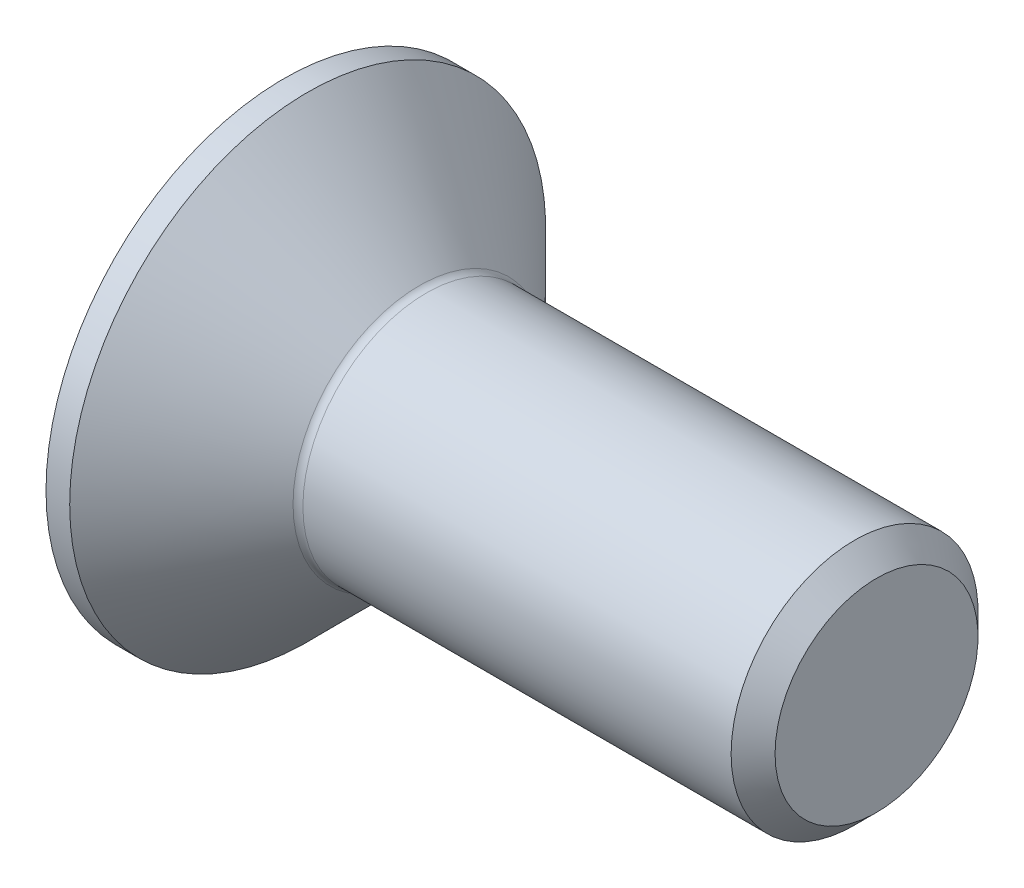
ISO-10303-21;
HEADER;
FILE_DESCRIPTION(('STEP AP214'),'2;1');
FILE_NAME('part.step','',(''),(''),'','','');
FILE_SCHEMA(('AUTOMOTIVE_DESIGN { 1 0 10303 214 1 1 1 1 }'));
ENDSEC;
DATA;
#1=APPLICATION_CONTEXT('core data for automotive mechanical design processes');
#2=APPLICATION_PROTOCOL_DEFINITION('international standard','automotive_design',2000,#1);
#3=PRODUCT_CONTEXT('',#1,'mechanical');
#4=PRODUCT('Part','Part','',(#3));
#5=PRODUCT_RELATED_PRODUCT_CATEGORY('part','',(#4));
#6=PRODUCT_DEFINITION_FORMATION('','',#4);
#7=PRODUCT_DEFINITION_CONTEXT('part definition',#1,'design');
#8=PRODUCT_DEFINITION('design','',#6,#7);
#9=PRODUCT_DEFINITION_SHAPE('','',#8);
#10=(LENGTH_UNIT() NAMED_UNIT(*) SI_UNIT(.MILLI.,.METRE.));
#11=(NAMED_UNIT(*) PLANE_ANGLE_UNIT() SI_UNIT($,.RADIAN.));
#12=(NAMED_UNIT(*) SI_UNIT($,.STERADIAN.) SOLID_ANGLE_UNIT());
#13=UNCERTAINTY_MEASURE_WITH_UNIT(LENGTH_MEASURE(1.E-05),#10,'distance_accuracy_value','');
#14=(GEOMETRIC_REPRESENTATION_CONTEXT(3) GLOBAL_UNCERTAINTY_ASSIGNED_CONTEXT((#13)) GLOBAL_UNIT_ASSIGNED_CONTEXT((#10,
#11,#12)) REPRESENTATION_CONTEXT('',''));
#15=CARTESIAN_POINT('',(0.,0.,0.));
#16=DIRECTION('',(0.,0.,1.));
#17=DIRECTION('',(1.,0.,0.));
#18=AXIS2_PLACEMENT_3D('',#15,#16,#17);
#19=CARTESIAN_POINT('',(0.,0.,0.));
#20=DIRECTION('',(-1.,0.,0.));
#21=DIRECTION('',(0.,0.,1.));
#22=AXIS2_PLACEMENT_3D('',#19,#20,#21);
#23=PLANE('',#22);
#24=CARTESIAN_POINT('',(0.,0.,0.));
#25=DIRECTION('',(-1.,0.,0.));
#26=DIRECTION('',(0.,0.,1.));
#27=AXIS2_PLACEMENT_3D('',#24,#25,#26);
#28=CIRCLE('',#27,4.82);
#29=CARTESIAN_POINT('',(0.,0.,4.82));
#30=VERTEX_POINT('',#29);
#31=EDGE_CURVE('E158',#30,#30,#28,.T.);
#32=ORIENTED_EDGE('',*,*,#31,.T.);
#33=EDGE_LOOP('',(#32));
#34=FACE_BOUND('',#33,.T.);
#35=DIRECTION('',(0.,-0.5,-0.866025403784439));
#36=VECTOR('',#35,1.);
#37=CARTESIAN_POINT('',(0.,-0.871798906476335,1.51));
#38=LINE('',#37,#36);
#39=CARTESIAN_POINT('',(0.,-0.871798906476335,1.51));
#40=VERTEX_POINT('',#39);
#41=CARTESIAN_POINT('',(0.,-1.74359781295267,0.));
#42=VERTEX_POINT('',#41);
#43=EDGE_CURVE('E120',#40,#42,#38,.T.);
#44=ORIENTED_EDGE('',*,*,#43,.T.);
#45=DIRECTION('',(0.,0.5,-0.866025403784439));
#46=VECTOR('',#45,1.);
#47=CARTESIAN_POINT('',(0.,-1.74359781295267,0.));
#48=LINE('',#47,#46);
#49=CARTESIAN_POINT('',(0.,-0.871798906476335,-1.51));
#50=VERTEX_POINT('',#49);
#51=EDGE_CURVE('E50',#42,#50,#48,.T.);
#52=ORIENTED_EDGE('',*,*,#51,.T.);
#53=DIRECTION('',(0.,1.,0.));
#54=VECTOR('',#53,1.);
#55=CARTESIAN_POINT('',(0.,-0.871798906476335,-1.51));
#56=LINE('',#55,#54);
#57=CARTESIAN_POINT('',(0.,0.871798906476335,-1.51));
#58=VERTEX_POINT('',#57);
#59=EDGE_CURVE('E135',#50,#58,#56,.T.);
#60=ORIENTED_EDGE('',*,*,#59,.T.);
#61=DIRECTION('',(0.,0.5,0.866025403784439));
#62=VECTOR('',#61,1.);
#63=CARTESIAN_POINT('',(0.,0.871798906476335,-1.51));
#64=LINE('',#63,#62);
#65=CARTESIAN_POINT('',(0.,1.74359781295267,0.));
#66=VERTEX_POINT('',#65);
#67=EDGE_CURVE('E271',#58,#66,#64,.T.);
#68=ORIENTED_EDGE('',*,*,#67,.T.);
#69=DIRECTION('',(0.,-0.5,0.866025403784439));
#70=VECTOR('',#69,1.);
#71=CARTESIAN_POINT('',(0.,1.74359781295267,0.));
#72=LINE('',#71,#70);
#73=CARTESIAN_POINT('',(0.,0.871798906476335,1.51));
#74=VERTEX_POINT('',#73);
#75=EDGE_CURVE('E274',#66,#74,#72,.T.);
#76=ORIENTED_EDGE('',*,*,#75,.T.);
#77=DIRECTION('',(0.,-1.,0.));
#78=VECTOR('',#77,1.);
#79=CARTESIAN_POINT('',(0.,0.871798906476335,1.51));
#80=LINE('',#79,#78);
#81=EDGE_CURVE('E277',#74,#40,#80,.T.);
#82=ORIENTED_EDGE('',*,*,#81,.T.);
#83=EDGE_LOOP('',(#44,#52,#60,#68,#76,#82));
#84=FACE_BOUND('',#83,.T.);
#85=ADVANCED_FACE('F35',(#34,#84),#23,.T.);
#86=CARTESIAN_POINT('',(0.,0.,0.));
#87=DIRECTION('',(-1.,0.,0.));
#88=DIRECTION('',(0.,0.,1.));
#89=AXIS2_PLACEMENT_3D('',#86,#87,#88);
#90=CYLINDRICAL_SURFACE('',#89,4.82);
#91=CARTESIAN_POINT('',(0.480000000000009,0.,0.));
#92=DIRECTION('',(-1.,0.,0.));
#93=DIRECTION('',(0.,0.,1.));
#94=AXIS2_PLACEMENT_3D('',#91,#92,#93);
#95=CIRCLE('',#94,4.82);
#96=CARTESIAN_POINT('',(0.480000000000009,0.,4.82));
#97=VERTEX_POINT('',#96);
#98=EDGE_CURVE('E155',#97,#97,#95,.T.);
#99=ORIENTED_EDGE('',*,*,#98,.T.);
#100=EDGE_LOOP('',(#99));
#101=FACE_BOUND('',#100,.T.);
#102=ORIENTED_EDGE('',*,*,#31,.F.);
#103=EDGE_LOOP('',(#102));
#104=FACE_BOUND('',#103,.T.);
#105=ADVANCED_FACE('F179',(#101,#104),#90,.T.);
#106=CARTESIAN_POINT('',(0.480000000000009,0.,0.));
#107=DIRECTION('',(-1.,0.,0.));
#108=DIRECTION('',(0.,0.,1.));
#109=AXIS2_PLACEMENT_3D('',#106,#107,#108);
#110=CONICAL_SURFACE('',#109,4.82,0.78539816339745);
#111=CARTESIAN_POINT('',(2.74142135623732,0.,0.));
#112=DIRECTION('',(-1.,0.,0.));
#113=DIRECTION('',(0.,0.,1.));
#114=AXIS2_PLACEMENT_3D('',#111,#112,#113);
#115=CIRCLE('',#114,2.55857864376268);
#116=CARTESIAN_POINT('',(2.74142135623732,0.,2.55857864376268));
#117=VERTEX_POINT('',#116);
#118=EDGE_CURVE('E43',#117,#117,#115,.T.);
#119=ORIENTED_EDGE('',*,*,#118,.T.);
#120=EDGE_LOOP('',(#119));
#121=FACE_BOUND('',#120,.T.);
#122=ORIENTED_EDGE('',*,*,#98,.F.);
#123=EDGE_LOOP('',(#122));
#124=FACE_BOUND('',#123,.T.);
#125=ADVANCED_FACE('F163',(#121,#124),#110,.T.);
#126=CARTESIAN_POINT('',(0.,0.,0.));
#127=DIRECTION('',(-1.,0.,0.));
#128=DIRECTION('',(0.,0.,1.));
#129=AXIS2_PLACEMENT_3D('',#126,#127,#128);
#130=CYLINDRICAL_SURFACE('',#129,2.49999999999999);
#131=CARTESIAN_POINT('',(2.88284271247463,0.,0.));
#132=DIRECTION('',(-1.,0.,0.));
#133=DIRECTION('',(0.,0.,1.));
#134=AXIS2_PLACEMENT_3D('',#131,#132,#133);
#135=CIRCLE('',#134,2.49999999999999);
#136=CARTESIAN_POINT('',(2.88284271247463,0.,2.49999999999999));
#137=VERTEX_POINT('',#136);
#138=EDGE_CURVE('E11',#137,#137,#135,.F.);
#139=ORIENTED_EDGE('',*,*,#138,.T.);
#140=EDGE_LOOP('',(#139));
#141=FACE_BOUND('',#140,.T.);
#142=CARTESIAN_POINT('',(11.555,0.,0.));
#143=DIRECTION('',(-1.,0.,0.));
#144=DIRECTION('',(0.,0.,1.));
#145=AXIS2_PLACEMENT_3D('',#142,#143,#144);
#146=CIRCLE('',#145,2.49999999999999);
#147=CARTESIAN_POINT('',(11.555,0.,2.49999999999999));
#148=VERTEX_POINT('',#147);
#149=EDGE_CURVE('E152',#148,#148,#146,.T.);
#150=ORIENTED_EDGE('',*,*,#149,.T.);
#151=EDGE_LOOP('',(#150));
#152=FACE_BOUND('',#151,.T.);
#153=ADVANCED_FACE('F190',(#141,#152),#130,.T.);
#154=CARTESIAN_POINT('',(12.,0.,0.));
#155=DIRECTION('',(-1.,0.,0.));
#156=DIRECTION('',(0.,0.,1.));
#157=AXIS2_PLACEMENT_3D('',#154,#155,#156);
#158=CONICAL_SURFACE('',#157,2.055,0.785398163397428);
#159=ORIENTED_EDGE('',*,*,#149,.F.);
#160=EDGE_LOOP('',(#159));
#161=FACE_BOUND('',#160,.T.);
#162=CARTESIAN_POINT('',(12.,0.,0.));
#163=DIRECTION('',(-1.,0.,0.));
#164=DIRECTION('',(0.,0.,1.));
#165=AXIS2_PLACEMENT_3D('',#162,#163,#164);
#166=CIRCLE('',#165,2.055);
#167=CARTESIAN_POINT('',(12.,0.,2.055));
#168=VERTEX_POINT('',#167);
#169=EDGE_CURVE('E148',#168,#168,#166,.T.);
#170=ORIENTED_EDGE('',*,*,#169,.T.);
#171=EDGE_LOOP('',(#170));
#172=FACE_BOUND('',#171,.T.);
#173=ADVANCED_FACE('F174',(#161,#172),#158,.T.);
#174=CARTESIAN_POINT('',(12.,2.055,0.));
#175=DIRECTION('',(1.,0.,0.));
#176=DIRECTION('',(0.,0.,-1.));
#177=AXIS2_PLACEMENT_3D('',#174,#175,#176);
#178=PLANE('',#177);
#179=ORIENTED_EDGE('',*,*,#169,.F.);
#180=EDGE_LOOP('',(#179));
#181=FACE_BOUND('',#180,.T.);
#182=ADVANCED_FACE('F167',(#181),#178,.T.);
#183=CARTESIAN_POINT('',(2.88284271247463,0.,0.));
#184=DIRECTION('',(-1.,0.,0.));
#185=DIRECTION('',(0.,0.,1.));
#186=AXIS2_PLACEMENT_3D('',#183,#184,#185);
#187=TOROIDAL_SURFACE('',#186,2.69999999999999,0.2);
#188=ORIENTED_EDGE('',*,*,#138,.F.);
#189=EDGE_LOOP('',(#188));
#190=FACE_BOUND('',#189,.T.);
#191=ORIENTED_EDGE('',*,*,#118,.F.);
#192=EDGE_LOOP('',(#191));
#193=FACE_BOUND('',#192,.T.);
#194=ADVANCED_FACE('F37',(#190,#193),#187,.F.);
#195=CARTESIAN_POINT('',(2.3,-1.74359781295267,0.));
#196=DIRECTION('',(0.,0.866025403784438,0.5));
#197=DIRECTION('',(0.,-0.5,0.866025403784439));
#198=AXIS2_PLACEMENT_3D('',#195,#196,#197);
#199=PLANE('',#198);
#200=ORIENTED_EDGE('',*,*,#51,.F.);
#201=DIRECTION('',(-1.,0.,0.));
#202=VECTOR('',#201,1.);
#203=CARTESIAN_POINT('',(2.3,-1.74359781295267,0.));
#204=LINE('',#203,#202);
#205=CARTESIAN_POINT('',(2.3,-1.74359781295267,0.));
#206=VERTEX_POINT('',#205);
#207=EDGE_CURVE('E268',#206,#42,#204,.T.);
#208=ORIENTED_EDGE('',*,*,#207,.F.);
#209=DIRECTION('',(0.,0.5,-0.866025403784439));
#210=VECTOR('',#209,1.);
#211=CARTESIAN_POINT('',(2.3,-1.74359781295267,0.));
#212=LINE('',#211,#210);
#213=CARTESIAN_POINT('',(2.3,-1.3076983597145,-0.755000000000001));
#214=VERTEX_POINT('',#213);
#215=EDGE_CURVE('E117',#206,#214,#212,.T.);
#216=ORIENTED_EDGE('',*,*,#215,.T.);
#217=CARTESIAN_POINT('',(2.3,-0.871798906476335,-1.51));
#218=VERTEX_POINT('',#217);
#219=EDGE_CURVE('E111',#214,#218,#212,.T.);
#220=ORIENTED_EDGE('',*,*,#219,.T.);
#221=DIRECTION('',(-1.,0.,0.));
#222=VECTOR('',#221,1.);
#223=CARTESIAN_POINT('',(2.3,-0.871798906476335,-1.51));
#224=LINE('',#223,#222);
#225=EDGE_CURVE('E115',#218,#50,#224,.T.);
#226=ORIENTED_EDGE('',*,*,#225,.T.);
#227=EDGE_LOOP('',(#200,#208,#216,#220,#226));
#228=FACE_BOUND('',#227,.T.);
#229=ADVANCED_FACE('F113',(#228),#199,.T.);
#230=CARTESIAN_POINT('',(2.3,-0.871798906476335,-1.51));
#231=DIRECTION('',(0.,0.,1.));
#232=DIRECTION('',(1.,0.,0.));
#233=AXIS2_PLACEMENT_3D('',#230,#231,#232);
#234=PLANE('',#233);
#235=ORIENTED_EDGE('',*,*,#59,.F.);
#236=ORIENTED_EDGE('',*,*,#225,.F.);
#237=DIRECTION('',(0.,1.,0.));
#238=VECTOR('',#237,1.);
#239=CARTESIAN_POINT('',(2.3,-0.871798906476335,-1.51));
#240=LINE('',#239,#238);
#241=CARTESIAN_POINT('',(2.3,0.,-1.51));
#242=VERTEX_POINT('',#241);
#243=EDGE_CURVE('E123',#218,#242,#240,.T.);
#244=ORIENTED_EDGE('',*,*,#243,.T.);
#245=CARTESIAN_POINT('',(2.3,0.871798906476335,-1.51));
#246=VERTEX_POINT('',#245);
#247=EDGE_CURVE('E130',#242,#246,#240,.T.);
#248=ORIENTED_EDGE('',*,*,#247,.T.);
#249=DIRECTION('',(-1.,0.,0.));
#250=VECTOR('',#249,1.);
#251=CARTESIAN_POINT('',(2.3,0.871798906476335,-1.51));
#252=LINE('',#251,#250);
#253=EDGE_CURVE('E137',#246,#58,#252,.T.);
#254=ORIENTED_EDGE('',*,*,#253,.T.);
#255=EDGE_LOOP('',(#235,#236,#244,#248,#254));
#256=FACE_BOUND('',#255,.T.);
#257=ADVANCED_FACE('F132',(#256),#234,.T.);
#258=CARTESIAN_POINT('',(2.3,0.871798906476335,-1.51));
#259=DIRECTION('',(0.,-0.866025403784439,0.5));
#260=DIRECTION('',(0.,-0.5,-0.866025403784438));
#261=AXIS2_PLACEMENT_3D('',#258,#259,#260);
#262=PLANE('',#261);
#263=ORIENTED_EDGE('',*,*,#67,.F.);
#264=ORIENTED_EDGE('',*,*,#253,.F.);
#265=DIRECTION('',(0.,0.5,0.866025403784439));
#266=VECTOR('',#265,1.);
#267=CARTESIAN_POINT('',(2.3,0.871798906476335,-1.51));
#268=LINE('',#267,#266);
#269=CARTESIAN_POINT('',(2.3,1.3076983597145,-0.755));
#270=VERTEX_POINT('',#269);
#271=EDGE_CURVE('E260',#246,#270,#268,.T.);
#272=ORIENTED_EDGE('',*,*,#271,.T.);
#273=CARTESIAN_POINT('',(2.3,1.74359781295267,0.));
#274=VERTEX_POINT('',#273);
#275=EDGE_CURVE('E129',#270,#274,#268,.T.);
#276=ORIENTED_EDGE('',*,*,#275,.T.);
#277=DIRECTION('',(-1.,0.,0.));
#278=VECTOR('',#277,1.);
#279=CARTESIAN_POINT('',(2.3,1.74359781295267,0.));
#280=LINE('',#279,#278);
#281=EDGE_CURVE('E143',#274,#66,#280,.T.);
#282=ORIENTED_EDGE('',*,*,#281,.T.);
#283=EDGE_LOOP('',(#263,#264,#272,#276,#282));
#284=FACE_BOUND('',#283,.T.);
#285=ADVANCED_FACE('F204',(#284),#262,.T.);
#286=CARTESIAN_POINT('',(2.3,1.74359781295267,0.));
#287=DIRECTION('',(0.,-0.866025403784439,-0.5));
#288=DIRECTION('',(0.,0.5,-0.866025403784438));
#289=AXIS2_PLACEMENT_3D('',#286,#287,#288);
#290=PLANE('',#289);
#291=ORIENTED_EDGE('',*,*,#75,.F.);
#292=ORIENTED_EDGE('',*,*,#281,.F.);
#293=DIRECTION('',(0.,-0.5,0.866025403784439));
#294=VECTOR('',#293,1.);
#295=CARTESIAN_POINT('',(2.3,1.74359781295267,0.));
#296=LINE('',#295,#294);
#297=CARTESIAN_POINT('',(2.3,1.3076983597145,0.755));
#298=VERTEX_POINT('',#297);
#299=EDGE_CURVE('E58',#274,#298,#296,.T.);
#300=ORIENTED_EDGE('',*,*,#299,.T.);
#301=CARTESIAN_POINT('',(2.3,0.871798906476335,1.51));
#302=VERTEX_POINT('',#301);
#303=EDGE_CURVE('E239',#298,#302,#296,.T.);
#304=ORIENTED_EDGE('',*,*,#303,.T.);
#305=DIRECTION('',(-1.,0.,0.));
#306=VECTOR('',#305,1.);
#307=CARTESIAN_POINT('',(2.3,0.871798906476335,1.51));
#308=LINE('',#307,#306);
#309=EDGE_CURVE('E253',#302,#74,#308,.T.);
#310=ORIENTED_EDGE('',*,*,#309,.T.);
#311=EDGE_LOOP('',(#291,#292,#300,#304,#310));
#312=FACE_BOUND('',#311,.T.);
#313=ADVANCED_FACE('F207',(#312),#290,.T.);
#314=CARTESIAN_POINT('',(2.3,0.871798906476335,1.51));
#315=DIRECTION('',(0.,0.,-1.));
#316=DIRECTION('',(-1.,0.,0.));
#317=AXIS2_PLACEMENT_3D('',#314,#315,#316);
#318=PLANE('',#317);
#319=ORIENTED_EDGE('',*,*,#81,.F.);
#320=ORIENTED_EDGE('',*,*,#309,.F.);
#321=DIRECTION('',(0.,-1.,0.));
#322=VECTOR('',#321,1.);
#323=CARTESIAN_POINT('',(2.3,0.871798906476335,1.51));
#324=LINE('',#323,#322);
#325=CARTESIAN_POINT('',(2.3,0.,1.51));
#326=VERTEX_POINT('',#325);
#327=EDGE_CURVE('E238',#302,#326,#324,.T.);
#328=ORIENTED_EDGE('',*,*,#327,.T.);
#329=CARTESIAN_POINT('',(2.3,-0.871798906476335,1.51));
#330=VERTEX_POINT('',#329);
#331=EDGE_CURVE('E244',#326,#330,#324,.T.);
#332=ORIENTED_EDGE('',*,*,#331,.T.);
#333=DIRECTION('',(-1.,0.,0.));
#334=VECTOR('',#333,1.);
#335=CARTESIAN_POINT('',(2.3,-0.871798906476335,1.51));
#336=LINE('',#335,#334);
#337=EDGE_CURVE('E283',#330,#40,#336,.T.);
#338=ORIENTED_EDGE('',*,*,#337,.T.);
#339=EDGE_LOOP('',(#319,#320,#328,#332,#338));
#340=FACE_BOUND('',#339,.T.);
#341=ADVANCED_FACE('F211',(#340),#318,.T.);
#342=CARTESIAN_POINT('',(2.3,-0.871798906476335,1.51));
#343=DIRECTION('',(0.,0.866025403784438,-0.5));
#344=DIRECTION('',(0.,0.5,0.866025403784439));
#345=AXIS2_PLACEMENT_3D('',#342,#343,#344);
#346=PLANE('',#345);
#347=ORIENTED_EDGE('',*,*,#43,.F.);
#348=ORIENTED_EDGE('',*,*,#337,.F.);
#349=DIRECTION('',(0.,-0.5,-0.866025403784439));
#350=VECTOR('',#349,1.);
#351=CARTESIAN_POINT('',(2.3,-0.871798906476335,1.51));
#352=LINE('',#351,#350);
#353=CARTESIAN_POINT('',(2.3,-1.3076983597145,0.755000000000001));
#354=VERTEX_POINT('',#353);
#355=EDGE_CURVE('E247',#330,#354,#352,.T.);
#356=ORIENTED_EDGE('',*,*,#355,.T.);
#357=EDGE_CURVE('E254',#354,#206,#352,.T.);
#358=ORIENTED_EDGE('',*,*,#357,.T.);
#359=ORIENTED_EDGE('',*,*,#207,.T.);
#360=EDGE_LOOP('',(#347,#348,#356,#358,#359));
#361=FACE_BOUND('',#360,.T.);
#362=ADVANCED_FACE('F214',(#361),#346,.T.);
#363=CARTESIAN_POINT('',(2.3,-1.74359781295267,0.));
#364=DIRECTION('',(-1.,0.,0.));
#365=DIRECTION('',(0.,0.,1.));
#366=AXIS2_PLACEMENT_3D('',#363,#364,#365);
#367=PLANE('',#366);
#368=CARTESIAN_POINT('',(2.3,0.,0.));
#369=DIRECTION('',(-1.,0.,0.));
#370=DIRECTION('',(0.,0.,1.));
#371=AXIS2_PLACEMENT_3D('',#368,#369,#370);
#372=CIRCLE('',#371,1.51);
#373=EDGE_CURVE('E136',#354,#326,#372,.T.);
#374=ORIENTED_EDGE('',*,*,#373,.F.);
#375=ORIENTED_EDGE('',*,*,#355,.F.);
#376=ORIENTED_EDGE('',*,*,#331,.F.);
#377=EDGE_LOOP('',(#374,#375,#376));
#378=FACE_BOUND('',#377,.T.);
#379=ADVANCED_FACE('F218',(#378),#367,.T.);
#380=EDGE_CURVE('E140',#214,#354,#372,.T.);
#381=ORIENTED_EDGE('',*,*,#380,.F.);
#382=ORIENTED_EDGE('',*,*,#215,.F.);
#383=ORIENTED_EDGE('',*,*,#357,.F.);
#384=EDGE_LOOP('',(#381,#382,#383));
#385=FACE_BOUND('',#384,.T.);
#386=ADVANCED_FACE('F221',(#385),#367,.T.);
#387=EDGE_CURVE('E125',#242,#214,#372,.T.);
#388=ORIENTED_EDGE('',*,*,#387,.F.);
#389=ORIENTED_EDGE('',*,*,#243,.F.);
#390=ORIENTED_EDGE('',*,*,#219,.F.);
#391=EDGE_LOOP('',(#388,#389,#390));
#392=FACE_BOUND('',#391,.T.);
#393=ADVANCED_FACE('F124',(#392),#367,.T.);
#394=EDGE_CURVE('E256',#270,#242,#372,.T.);
#395=ORIENTED_EDGE('',*,*,#394,.F.);
#396=ORIENTED_EDGE('',*,*,#271,.F.);
#397=ORIENTED_EDGE('',*,*,#247,.F.);
#398=EDGE_LOOP('',(#395,#396,#397));
#399=FACE_BOUND('',#398,.T.);
#400=ADVANCED_FACE('F233',(#399),#367,.T.);
#401=EDGE_CURVE('E149',#298,#270,#372,.T.);
#402=ORIENTED_EDGE('',*,*,#401,.F.);
#403=ORIENTED_EDGE('',*,*,#299,.F.);
#404=ORIENTED_EDGE('',*,*,#275,.F.);
#405=EDGE_LOOP('',(#402,#403,#404));
#406=FACE_BOUND('',#405,.T.);
#407=ADVANCED_FACE('F228',(#406),#367,.T.);
#408=EDGE_CURVE('E142',#326,#298,#372,.T.);
#409=ORIENTED_EDGE('',*,*,#408,.F.);
#410=ORIENTED_EDGE('',*,*,#327,.F.);
#411=ORIENTED_EDGE('',*,*,#303,.F.);
#412=EDGE_LOOP('',(#409,#410,#411));
#413=FACE_BOUND('',#412,.T.);
#414=ADVANCED_FACE('F199',(#413),#367,.T.);
#415=CARTESIAN_POINT('',(2.3,0.,0.));
#416=DIRECTION('',(-1.,0.,0.));
#417=DIRECTION('',(0.,0.,1.));
#418=AXIS2_PLACEMENT_3D('',#415,#416,#417);
#419=CONICAL_SURFACE('',#418,1.51,1.04719755119659);
#420=CARTESIAN_POINT('',(3.17179890647634,0.,0.));
#421=VERTEX_POINT('',#420);
#422=VERTEX_LOOP('',#421);
#423=FACE_BOUND('',#422,.T.);
#424=ORIENTED_EDGE('',*,*,#408,.T.);
#425=ORIENTED_EDGE('',*,*,#401,.T.);
#426=ORIENTED_EDGE('',*,*,#394,.T.);
#427=ORIENTED_EDGE('',*,*,#387,.T.);
#428=ORIENTED_EDGE('',*,*,#380,.T.);
#429=ORIENTED_EDGE('',*,*,#373,.T.);
#430=EDGE_LOOP('',(#424,#425,#426,#427,#428,#429));
#431=FACE_BOUND('',#430,.T.);
#432=ADVANCED_FACE('F197',(#423,#431),#419,.F.);
#433=CLOSED_SHELL('',(#85,#105,#125,#153,#173,#182,#194,#229,#257,#285,#313,#341,#362,#379,#386,
#393,#400,#407,#414,#432));
#434=MANIFOLD_SOLID_BREP('B2',#433);
#435=ADVANCED_BREP_SHAPE_REPRESENTATION('',(#18,#434),#14);
#436=SHAPE_DEFINITION_REPRESENTATION(#9,#435);
ENDSEC;
END-ISO-10303-21;
